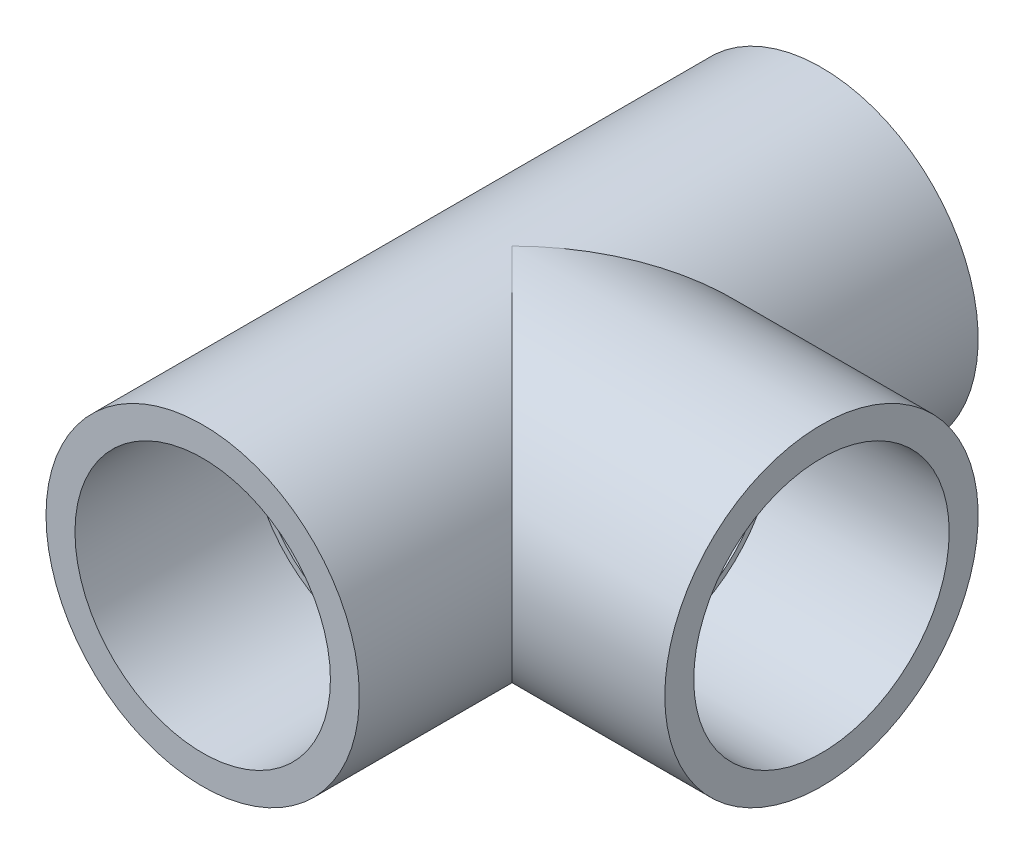
ISO-10303-21;
HEADER;
FILE_DESCRIPTION(('STEP AP214'),'2;1');
FILE_NAME('part.step','',(''),(''),'','','');
FILE_SCHEMA(('AUTOMOTIVE_DESIGN { 1 0 10303 214 1 1 1 1 }'));
ENDSEC;
DATA;
#1=APPLICATION_CONTEXT('core data for automotive mechanical design processes');
#2=APPLICATION_PROTOCOL_DEFINITION('international standard','automotive_design',2000,#1);
#3=PRODUCT_CONTEXT('',#1,'mechanical');
#4=PRODUCT('Part','Part','',(#3));
#5=PRODUCT_RELATED_PRODUCT_CATEGORY('part','',(#4));
#6=PRODUCT_DEFINITION_FORMATION('','',#4);
#7=PRODUCT_DEFINITION_CONTEXT('part definition',#1,'design');
#8=PRODUCT_DEFINITION('design','',#6,#7);
#9=PRODUCT_DEFINITION_SHAPE('','',#8);
#10=(LENGTH_UNIT() NAMED_UNIT(*) SI_UNIT(.MILLI.,.METRE.));
#11=(NAMED_UNIT(*) PLANE_ANGLE_UNIT() SI_UNIT($,.RADIAN.));
#12=(NAMED_UNIT(*) SI_UNIT($,.STERADIAN.) SOLID_ANGLE_UNIT());
#13=UNCERTAINTY_MEASURE_WITH_UNIT(LENGTH_MEASURE(1.E-05),#10,'distance_accuracy_value','');
#14=(GEOMETRIC_REPRESENTATION_CONTEXT(3) GLOBAL_UNCERTAINTY_ASSIGNED_CONTEXT((#13)) GLOBAL_UNIT_ASSIGNED_CONTEXT((#10,
#11,#12)) REPRESENTATION_CONTEXT('',''));
#15=CARTESIAN_POINT('',(0.,0.,0.));
#16=DIRECTION('',(0.,0.,1.));
#17=DIRECTION('',(1.,0.,0.));
#18=AXIS2_PLACEMENT_3D('',#15,#16,#17);
#19=CARTESIAN_POINT('',(2.5,0.,0.));
#20=DIRECTION('',(-1.,0.,0.));
#21=DIRECTION('',(0.,0.,1.));
#22=AXIS2_PLACEMENT_3D('',#19,#20,#21);
#23=CYLINDRICAL_SURFACE('',#22,15.4);
#24=CARTESIAN_POINT('',(0.,0.,0.));
#25=DIRECTION('',(-1.,0.,0.));
#26=DIRECTION('',(0.,0.,1.));
#27=AXIS2_PLACEMENT_3D('',#24,#25,#26);
#28=CIRCLE('',#27,15.4);
#29=CARTESIAN_POINT('',(0.,0.,15.4));
#30=VERTEX_POINT('',#29);
#31=EDGE_CURVE('E18',#30,#30,#28,.F.);
#32=ORIENTED_EDGE('',*,*,#31,.T.);
#33=EDGE_LOOP('',(#32));
#34=FACE_BOUND('',#33,.T.);
#35=CARTESIAN_POINT('',(-17.,0.,0.));
#36=DIRECTION('',(-0.707106781186547,0.,-0.707106781186547));
#37=DIRECTION('',(-0.707106781186547,0.,0.707106781186547));
#38=AXIS2_PLACEMENT_3D('',#35,#36,#37);
#39=ELLIPSE('',#38,21.7788888605457,15.4);
#40=CARTESIAN_POINT('',(-17.,15.4,0.));
#41=VERTEX_POINT('',#40);
#42=CARTESIAN_POINT('',(-17.,-15.4,0.));
#43=VERTEX_POINT('',#42);
#44=EDGE_CURVE('E44',#41,#43,#39,.T.);
#45=ORIENTED_EDGE('',*,*,#44,.T.);
#46=CARTESIAN_POINT('',(-17.,0.,0.));
#47=DIRECTION('',(-0.707106781186547,0.,0.707106781186547));
#48=DIRECTION('',(-0.707106781186547,0.,-0.707106781186547));
#49=AXIS2_PLACEMENT_3D('',#46,#47,#48);
#50=ELLIPSE('',#49,21.7788888605457,15.4);
#51=EDGE_CURVE('E40',#43,#41,#50,.T.);
#52=ORIENTED_EDGE('',*,*,#51,.T.);
#53=EDGE_LOOP('',(#45,#52));
#54=FACE_BOUND('',#53,.T.);
#55=ADVANCED_FACE('F15',(#34,#54),#23,.F.);
#56=CARTESIAN_POINT('',(0.,0.,0.));
#57=DIRECTION('',(-1.,0.,0.));
#58=DIRECTION('',(0.,0.,1.));
#59=AXIS2_PLACEMENT_3D('',#56,#57,#58);
#60=PLANE('',#59);
#61=CARTESIAN_POINT('',(0.,0.,0.));
#62=DIRECTION('',(-1.,0.,0.));
#63=DIRECTION('',(0.,0.,1.));
#64=AXIS2_PLACEMENT_3D('',#61,#62,#63);
#65=CIRCLE('',#64,16.1);
#66=CARTESIAN_POINT('',(0.,0.,16.1));
#67=VERTEX_POINT('',#66);
#68=EDGE_CURVE('E45',#67,#67,#65,.F.);
#69=ORIENTED_EDGE('',*,*,#68,.T.);
#70=EDGE_LOOP('',(#69));
#71=FACE_BOUND('',#70,.T.);
#72=ORIENTED_EDGE('',*,*,#31,.F.);
#73=EDGE_LOOP('',(#72));
#74=FACE_BOUND('',#73,.T.);
#75=ADVANCED_FACE('F108',(#71,#74),#60,.F.);
#76=CARTESIAN_POINT('',(-17.,0.,0.));
#77=DIRECTION('',(0.,0.,-1.));
#78=DIRECTION('',(-1.,0.,0.));
#79=AXIS2_PLACEMENT_3D('',#76,#77,#78);
#80=CYLINDRICAL_SURFACE('',#79,15.4);
#81=CARTESIAN_POINT('',(-17.,0.,-17.));
#82=DIRECTION('',(0.,0.,-1.));
#83=DIRECTION('',(-1.,0.,0.));
#84=AXIS2_PLACEMENT_3D('',#81,#82,#83);
#85=CIRCLE('',#84,15.4);
#86=CARTESIAN_POINT('',(-32.4,0.,-17.));
#87=VERTEX_POINT('',#86);
#88=EDGE_CURVE('E53',#87,#87,#85,.T.);
#89=ORIENTED_EDGE('',*,*,#88,.T.);
#90=EDGE_LOOP('',(#89));
#91=FACE_BOUND('',#90,.T.);
#92=CARTESIAN_POINT('',(-17.,0.,17.));
#93=DIRECTION('',(0.,0.,-1.));
#94=DIRECTION('',(-1.,0.,0.));
#95=AXIS2_PLACEMENT_3D('',#92,#93,#94);
#96=CIRCLE('',#95,15.4);
#97=CARTESIAN_POINT('',(-32.4,0.,17.));
#98=VERTEX_POINT('',#97);
#99=EDGE_CURVE('E48',#98,#98,#96,.F.);
#100=ORIENTED_EDGE('',*,*,#99,.T.);
#101=EDGE_LOOP('',(#100));
#102=FACE_BOUND('',#101,.T.);
#103=ORIENTED_EDGE('',*,*,#51,.F.);
#104=ORIENTED_EDGE('',*,*,#44,.F.);
#105=EDGE_LOOP('',(#103,#104));
#106=FACE_BOUND('',#105,.T.);
#107=ADVANCED_FACE('F43',(#91,#102,#106),#80,.F.);
#108=CARTESIAN_POINT('',(11.,0.,0.));
#109=DIRECTION('',(-1.,0.,0.));
#110=DIRECTION('',(0.,0.,1.));
#111=AXIS2_PLACEMENT_3D('',#108,#109,#110);
#112=CYLINDRICAL_SURFACE('',#111,16.1);
#113=CARTESIAN_POINT('',(22.,0.,0.));
#114=DIRECTION('',(-1.,0.,0.));
#115=DIRECTION('',(0.,0.,1.));
#116=AXIS2_PLACEMENT_3D('',#113,#114,#115);
#117=CIRCLE('',#116,16.1);
#118=CARTESIAN_POINT('',(22.,0.,16.1));
#119=VERTEX_POINT('',#118);
#120=EDGE_CURVE('E56',#119,#119,#117,.T.);
#121=ORIENTED_EDGE('',*,*,#120,.F.);
#122=EDGE_LOOP('',(#121));
#123=FACE_BOUND('',#122,.T.);
#124=ORIENTED_EDGE('',*,*,#68,.F.);
#125=EDGE_LOOP('',(#124));
#126=FACE_BOUND('',#125,.T.);
#127=ADVANCED_FACE('F103',(#123,#126),#112,.F.);
#128=CARTESIAN_POINT('',(-17.,0.,17.));
#129=DIRECTION('',(0.,0.,-1.));
#130=DIRECTION('',(-1.,0.,0.));
#131=AXIS2_PLACEMENT_3D('',#128,#129,#130);
#132=PLANE('',#131);
#133=CARTESIAN_POINT('',(-17.,0.,17.));
#134=DIRECTION('',(0.,0.,1.));
#135=DIRECTION('',(1.,0.,0.));
#136=AXIS2_PLACEMENT_3D('',#133,#134,#135);
#137=CIRCLE('',#136,16.1);
#138=CARTESIAN_POINT('',(-0.899999999999998,0.,17.));
#139=VERTEX_POINT('',#138);
#140=EDGE_CURVE('E59',#139,#139,#137,.T.);
#141=ORIENTED_EDGE('',*,*,#140,.T.);
#142=EDGE_LOOP('',(#141));
#143=FACE_BOUND('',#142,.T.);
#144=ORIENTED_EDGE('',*,*,#99,.F.);
#145=EDGE_LOOP('',(#144));
#146=FACE_BOUND('',#145,.T.);
#147=ADVANCED_FACE('F99',(#143,#146),#132,.F.);
#148=CARTESIAN_POINT('',(-17.,0.,-17.));
#149=DIRECTION('',(0.,0.,1.));
#150=DIRECTION('',(1.,0.,0.));
#151=AXIS2_PLACEMENT_3D('',#148,#149,#150);
#152=PLANE('',#151);
#153=CARTESIAN_POINT('',(-17.,0.,-17.));
#154=DIRECTION('',(0.,0.,-1.));
#155=DIRECTION('',(-1.,0.,0.));
#156=AXIS2_PLACEMENT_3D('',#153,#154,#155);
#157=CIRCLE('',#156,16.1);
#158=CARTESIAN_POINT('',(-33.1,0.,-17.));
#159=VERTEX_POINT('',#158);
#160=EDGE_CURVE('E62',#159,#159,#157,.T.);
#161=ORIENTED_EDGE('',*,*,#160,.T.);
#162=EDGE_LOOP('',(#161));
#163=FACE_BOUND('',#162,.T.);
#164=ORIENTED_EDGE('',*,*,#88,.F.);
#165=EDGE_LOOP('',(#164));
#166=FACE_BOUND('',#165,.T.);
#167=ADVANCED_FACE('F102',(#163,#166),#152,.F.);
#168=CARTESIAN_POINT('',(22.,0.,0.));
#169=DIRECTION('',(1.,0.,0.));
#170=DIRECTION('',(0.,0.,-1.));
#171=AXIS2_PLACEMENT_3D('',#168,#169,#170);
#172=PLANE('',#171);
#173=CARTESIAN_POINT('',(22.,0.,0.));
#174=DIRECTION('',(-1.,0.,0.));
#175=DIRECTION('',(0.,0.,1.));
#176=AXIS2_PLACEMENT_3D('',#173,#174,#175);
#177=CIRCLE('',#176,19.75);
#178=CARTESIAN_POINT('',(22.,0.,19.75));
#179=VERTEX_POINT('',#178);
#180=EDGE_CURVE('E65',#179,#179,#177,.T.);
#181=ORIENTED_EDGE('',*,*,#180,.F.);
#182=EDGE_LOOP('',(#181));
#183=FACE_BOUND('',#182,.T.);
#184=ORIENTED_EDGE('',*,*,#120,.T.);
#185=EDGE_LOOP('',(#184));
#186=FACE_BOUND('',#185,.T.);
#187=ADVANCED_FACE('F95',(#183,#186),#172,.T.);
#188=CARTESIAN_POINT('',(-17.,0.,28.));
#189=DIRECTION('',(0.,0.,1.));
#190=DIRECTION('',(1.,0.,0.));
#191=AXIS2_PLACEMENT_3D('',#188,#189,#190);
#192=CYLINDRICAL_SURFACE('',#191,16.1);
#193=CARTESIAN_POINT('',(-17.,0.,39.));
#194=DIRECTION('',(0.,0.,1.));
#195=DIRECTION('',(1.,0.,0.));
#196=AXIS2_PLACEMENT_3D('',#193,#194,#195);
#197=CIRCLE('',#196,16.1);
#198=CARTESIAN_POINT('',(-0.899999999999998,0.,39.));
#199=VERTEX_POINT('',#198);
#200=EDGE_CURVE('E68',#199,#199,#197,.F.);
#201=ORIENTED_EDGE('',*,*,#200,.F.);
#202=EDGE_LOOP('',(#201));
#203=FACE_BOUND('',#202,.T.);
#204=ORIENTED_EDGE('',*,*,#140,.F.);
#205=EDGE_LOOP('',(#204));
#206=FACE_BOUND('',#205,.T.);
#207=ADVANCED_FACE('F91',(#203,#206),#192,.F.);
#208=CARTESIAN_POINT('',(-17.,0.,-28.));
#209=DIRECTION('',(0.,0.,-1.));
#210=DIRECTION('',(-1.,0.,0.));
#211=AXIS2_PLACEMENT_3D('',#208,#209,#210);
#212=CYLINDRICAL_SURFACE('',#211,16.1);
#213=CARTESIAN_POINT('',(-17.,0.,-39.));
#214=DIRECTION('',(0.,0.,-1.));
#215=DIRECTION('',(-1.,0.,0.));
#216=AXIS2_PLACEMENT_3D('',#213,#214,#215);
#217=CIRCLE('',#216,16.1);
#218=CARTESIAN_POINT('',(-33.1,0.,-39.));
#219=VERTEX_POINT('',#218);
#220=EDGE_CURVE('E71',#219,#219,#217,.F.);
#221=ORIENTED_EDGE('',*,*,#220,.F.);
#222=EDGE_LOOP('',(#221));
#223=FACE_BOUND('',#222,.T.);
#224=ORIENTED_EDGE('',*,*,#160,.F.);
#225=EDGE_LOOP('',(#224));
#226=FACE_BOUND('',#225,.T.);
#227=ADVANCED_FACE('F94',(#223,#226),#212,.F.);
#228=CARTESIAN_POINT('',(2.5,0.,0.));
#229=DIRECTION('',(-1.,0.,0.));
#230=DIRECTION('',(0.,0.,1.));
#231=AXIS2_PLACEMENT_3D('',#228,#229,#230);
#232=CYLINDRICAL_SURFACE('',#231,19.75);
#233=ORIENTED_EDGE('',*,*,#180,.T.);
#234=EDGE_LOOP('',(#233));
#235=FACE_BOUND('',#234,.T.);
#236=CARTESIAN_POINT('',(-17.,0.,0.));
#237=DIRECTION('',(-0.707106781186547,0.,0.707106781186547));
#238=DIRECTION('',(-0.707106781186547,0.,-0.707106781186547));
#239=AXIS2_PLACEMENT_3D('',#236,#237,#238);
#240=ELLIPSE('',#239,27.9307178568686,19.75);
#241=CARTESIAN_POINT('',(-17.,-19.75,0.));
#242=VERTEX_POINT('',#241);
#243=CARTESIAN_POINT('',(-17.,19.75,0.));
#244=VERTEX_POINT('',#243);
#245=EDGE_CURVE('E32',#242,#244,#240,.T.);
#246=ORIENTED_EDGE('',*,*,#245,.F.);
#247=CARTESIAN_POINT('',(-17.,0.,0.));
#248=DIRECTION('',(-0.707106781186547,0.,-0.707106781186547));
#249=DIRECTION('',(-0.707106781186547,0.,0.707106781186547));
#250=AXIS2_PLACEMENT_3D('',#247,#248,#249);
#251=ELLIPSE('',#250,27.9307178568686,19.75);
#252=EDGE_CURVE('E74',#244,#242,#251,.T.);
#253=ORIENTED_EDGE('',*,*,#252,.F.);
#254=EDGE_LOOP('',(#246,#253));
#255=FACE_BOUND('',#254,.T.);
#256=ADVANCED_FACE('F87',(#235,#255),#232,.T.);
#257=CARTESIAN_POINT('',(-17.,0.,39.));
#258=DIRECTION('',(0.,0.,1.));
#259=DIRECTION('',(1.,0.,0.));
#260=AXIS2_PLACEMENT_3D('',#257,#258,#259);
#261=PLANE('',#260);
#262=CARTESIAN_POINT('',(-17.,0.,39.));
#263=DIRECTION('',(0.,0.,-1.));
#264=DIRECTION('',(-1.,0.,0.));
#265=AXIS2_PLACEMENT_3D('',#262,#263,#264);
#266=CIRCLE('',#265,19.75);
#267=CARTESIAN_POINT('',(-36.75,0.,39.));
#268=VERTEX_POINT('',#267);
#269=EDGE_CURVE('E24',#268,#268,#266,.T.);
#270=ORIENTED_EDGE('',*,*,#269,.F.);
#271=EDGE_LOOP('',(#270));
#272=FACE_BOUND('',#271,.T.);
#273=ORIENTED_EDGE('',*,*,#200,.T.);
#274=EDGE_LOOP('',(#273));
#275=FACE_BOUND('',#274,.T.);
#276=ADVANCED_FACE('F83',(#272,#275),#261,.T.);
#277=CARTESIAN_POINT('',(-17.,0.,-39.));
#278=DIRECTION('',(0.,0.,-1.));
#279=DIRECTION('',(-1.,0.,0.));
#280=AXIS2_PLACEMENT_3D('',#277,#278,#279);
#281=PLANE('',#280);
#282=CARTESIAN_POINT('',(-17.,0.,-39.));
#283=DIRECTION('',(0.,0.,-1.));
#284=DIRECTION('',(-1.,0.,0.));
#285=AXIS2_PLACEMENT_3D('',#282,#283,#284);
#286=CIRCLE('',#285,19.75);
#287=CARTESIAN_POINT('',(-36.75,0.,-39.));
#288=VERTEX_POINT('',#287);
#289=EDGE_CURVE('E9',#288,#288,#286,.F.);
#290=ORIENTED_EDGE('',*,*,#289,.F.);
#291=EDGE_LOOP('',(#290));
#292=FACE_BOUND('',#291,.T.);
#293=ORIENTED_EDGE('',*,*,#220,.T.);
#294=EDGE_LOOP('',(#293));
#295=FACE_BOUND('',#294,.T.);
#296=ADVANCED_FACE('F86',(#292,#295),#281,.T.);
#297=CARTESIAN_POINT('',(-17.,0.,0.));
#298=DIRECTION('',(0.,0.,-1.));
#299=DIRECTION('',(-1.,0.,0.));
#300=AXIS2_PLACEMENT_3D('',#297,#298,#299);
#301=CYLINDRICAL_SURFACE('',#300,19.75);
#302=ORIENTED_EDGE('',*,*,#245,.T.);
#303=ORIENTED_EDGE('',*,*,#252,.T.);
#304=EDGE_LOOP('',(#302,#303));
#305=FACE_BOUND('',#304,.T.);
#306=ORIENTED_EDGE('',*,*,#269,.T.);
#307=EDGE_LOOP('',(#306));
#308=FACE_BOUND('',#307,.T.);
#309=ORIENTED_EDGE('',*,*,#289,.T.);
#310=EDGE_LOOP('',(#309));
#311=FACE_BOUND('',#310,.T.);
#312=ADVANCED_FACE('F80',(#305,#308,#311),#301,.T.);
#313=CLOSED_SHELL('',(#55,#75,#107,#127,#147,#167,#187,#207,#227,#256,#276,#296,#312));
#314=MANIFOLD_SOLID_BREP('B1',#313);
#315=ADVANCED_BREP_SHAPE_REPRESENTATION('',(#18,#314),#14);
#316=SHAPE_DEFINITION_REPRESENTATION(#9,#315);
ENDSEC;
END-ISO-10303-21;
